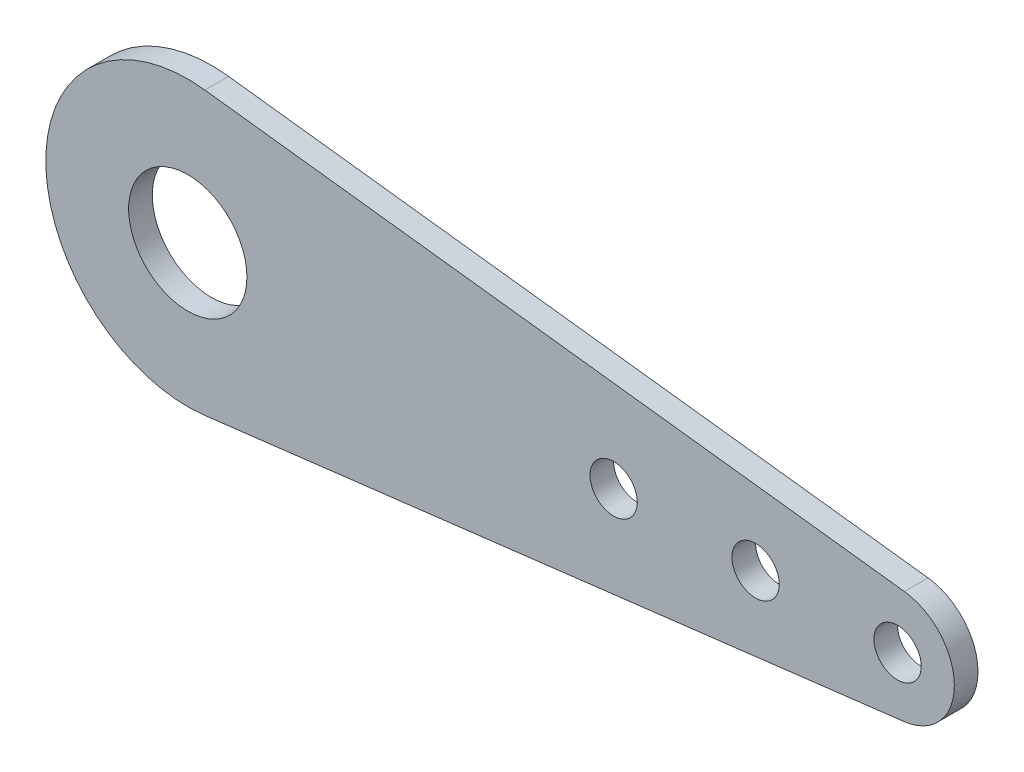
ISO-10303-21;
HEADER;
FILE_DESCRIPTION(('STEP AP214'),'2;1');
FILE_NAME('part.step','',(''),(''),'','','');
FILE_SCHEMA(('AUTOMOTIVE_DESIGN { 1 0 10303 214 1 1 1 1 }'));
ENDSEC;
DATA;
#1=APPLICATION_CONTEXT('core data for automotive mechanical design processes');
#2=APPLICATION_PROTOCOL_DEFINITION('international standard','automotive_design',2000,#1);
#3=PRODUCT_CONTEXT('',#1,'mechanical');
#4=PRODUCT('Part','Part','',(#3));
#5=PRODUCT_RELATED_PRODUCT_CATEGORY('part','',(#4));
#6=PRODUCT_DEFINITION_FORMATION('','',#4);
#7=PRODUCT_DEFINITION_CONTEXT('part definition',#1,'design');
#8=PRODUCT_DEFINITION('design','',#6,#7);
#9=PRODUCT_DEFINITION_SHAPE('','',#8);
#10=(LENGTH_UNIT() NAMED_UNIT(*) SI_UNIT(.MILLI.,.METRE.));
#11=(NAMED_UNIT(*) PLANE_ANGLE_UNIT() SI_UNIT($,.RADIAN.));
#12=(NAMED_UNIT(*) SI_UNIT($,.STERADIAN.) SOLID_ANGLE_UNIT());
#13=UNCERTAINTY_MEASURE_WITH_UNIT(LENGTH_MEASURE(1.E-05),#10,'distance_accuracy_value','');
#14=(GEOMETRIC_REPRESENTATION_CONTEXT(3) GLOBAL_UNCERTAINTY_ASSIGNED_CONTEXT((#13)) GLOBAL_UNIT_ASSIGNED_CONTEXT((#10,
#11,#12)) REPRESENTATION_CONTEXT('',''));
#15=CARTESIAN_POINT('',(0.,0.,0.));
#16=DIRECTION('',(0.,0.,1.));
#17=DIRECTION('',(1.,0.,0.));
#18=AXIS2_PLACEMENT_3D('',#15,#16,#17);
#19=CARTESIAN_POINT('',(0.,0.,1.5875));
#20=DIRECTION('',(0.,0.,-1.));
#21=DIRECTION('',(1.,0.,0.));
#22=AXIS2_PLACEMENT_3D('',#19,#20,#21);
#23=CYLINDRICAL_SURFACE('',#22,19.05);
#24=DIRECTION('',(0.,0.,-1.));
#25=VECTOR('',#24,1.);
#26=CARTESIAN_POINT('',(2.286,-18.9123426364901,1.5875));
#27=LINE('',#26,#25);
#28=CARTESIAN_POINT('',(2.286,-18.9123426364901,1.5875));
#29=VERTEX_POINT('',#28);
#30=CARTESIAN_POINT('',(2.286,-18.9123426364901,-1.5875));
#31=VERTEX_POINT('',#30);
#32=EDGE_CURVE('E49',#29,#31,#27,.T.);
#33=ORIENTED_EDGE('',*,*,#32,.F.);
#34=CARTESIAN_POINT('',(0.,0.,1.5875));
#35=DIRECTION('',(0.,0.,1.));
#36=DIRECTION('',(1.,0.,0.));
#37=AXIS2_PLACEMENT_3D('',#34,#35,#36);
#38=CIRCLE('',#37,19.05);
#39=CARTESIAN_POINT('',(2.286,18.9123426364901,1.5875));
#40=VERTEX_POINT('',#39);
#41=EDGE_CURVE('E121',#40,#29,#38,.T.);
#42=ORIENTED_EDGE('',*,*,#41,.F.);
#43=DIRECTION('',(0.,0.,-1.));
#44=VECTOR('',#43,1.);
#45=CARTESIAN_POINT('',(2.286,18.9123426364901,1.5875));
#46=LINE('',#45,#44);
#47=CARTESIAN_POINT('',(2.286,18.9123426364901,-1.5875));
#48=VERTEX_POINT('',#47);
#49=EDGE_CURVE('E11',#40,#48,#46,.T.);
#50=ORIENTED_EDGE('',*,*,#49,.T.);
#51=CARTESIAN_POINT('',(0.,0.,-1.5875));
#52=DIRECTION('',(0.,0.,1.));
#53=DIRECTION('',(1.,0.,0.));
#54=AXIS2_PLACEMENT_3D('',#51,#52,#53);
#55=CIRCLE('',#54,19.05);
#56=EDGE_CURVE('E92',#48,#31,#55,.T.);
#57=ORIENTED_EDGE('',*,*,#56,.T.);
#58=EDGE_LOOP('',(#33,#42,#50,#57));
#59=FACE_BOUND('',#58,.T.);
#60=ADVANCED_FACE('F45',(#59),#23,.T.);
#61=CARTESIAN_POINT('',(2.28600000000001,18.9123426364901,1.5875));
#62=DIRECTION('',(-0.12,-0.992773891679268,0.));
#63=DIRECTION('',(0.992773891679269,-0.12,0.));
#64=AXIS2_PLACEMENT_3D('',#61,#62,#63);
#65=PLANE('',#64);
#66=ORIENTED_EDGE('',*,*,#49,.F.);
#67=DIRECTION('',(0.992773891679269,-0.12,0.));
#68=VECTOR('',#67,1.);
#69=CARTESIAN_POINT('',(2.28600000000001,18.9123426364901,1.5875));
#70=LINE('',#69,#68);
#71=CARTESIAN_POINT('',(96.1644,7.56493705459603,1.5875));
#72=VERTEX_POINT('',#71);
#73=EDGE_CURVE('E62',#40,#72,#70,.T.);
#74=ORIENTED_EDGE('',*,*,#73,.T.);
#75=DIRECTION('',(0.,0.,-1.));
#76=VECTOR('',#75,1.);
#77=CARTESIAN_POINT('',(96.1644,7.56493705459603,1.5875));
#78=LINE('',#77,#76);
#79=CARTESIAN_POINT('',(96.1644,7.56493705459603,-1.5875));
#80=VERTEX_POINT('',#79);
#81=EDGE_CURVE('E54',#72,#80,#78,.T.);
#82=ORIENTED_EDGE('',*,*,#81,.T.);
#83=DIRECTION('',(0.992773891679269,-0.12,0.));
#84=VECTOR('',#83,1.);
#85=CARTESIAN_POINT('',(2.28600000000001,18.9123426364901,-1.5875));
#86=LINE('',#85,#84);
#87=EDGE_CURVE('E114',#48,#80,#86,.T.);
#88=ORIENTED_EDGE('',*,*,#87,.F.);
#89=EDGE_LOOP('',(#66,#74,#82,#88));
#90=FACE_BOUND('',#89,.T.);
#91=ADVANCED_FACE('F113',(#90),#65,.F.);
#92=CARTESIAN_POINT('',(95.25,0.,1.5875));
#93=DIRECTION('',(0.,0.,-1.));
#94=DIRECTION('',(1.,0.,0.));
#95=AXIS2_PLACEMENT_3D('',#92,#93,#94);
#96=CYLINDRICAL_SURFACE('',#95,7.62);
#97=ORIENTED_EDGE('',*,*,#81,.F.);
#98=CARTESIAN_POINT('',(95.25,0.,1.5875));
#99=DIRECTION('',(0.,0.,1.));
#100=DIRECTION('',(1.,0.,0.));
#101=AXIS2_PLACEMENT_3D('',#98,#99,#100);
#102=CIRCLE('',#101,7.62);
#103=CARTESIAN_POINT('',(96.1644,-7.56493705459603,1.5875));
#104=VERTEX_POINT('',#103);
#105=EDGE_CURVE('E67',#104,#72,#102,.T.);
#106=ORIENTED_EDGE('',*,*,#105,.F.);
#107=DIRECTION('',(0.,0.,-1.));
#108=VECTOR('',#107,1.);
#109=CARTESIAN_POINT('',(96.1644,-7.56493705459603,1.5875));
#110=LINE('',#109,#108);
#111=CARTESIAN_POINT('',(96.1644,-7.56493705459603,-1.5875));
#112=VERTEX_POINT('',#111);
#113=EDGE_CURVE('E106',#104,#112,#110,.T.);
#114=ORIENTED_EDGE('',*,*,#113,.T.);
#115=CARTESIAN_POINT('',(95.25,0.,-1.5875));
#116=DIRECTION('',(0.,0.,1.));
#117=DIRECTION('',(1.,0.,0.));
#118=AXIS2_PLACEMENT_3D('',#115,#116,#117);
#119=CIRCLE('',#118,7.62);
#120=EDGE_CURVE('E93',#112,#80,#119,.T.);
#121=ORIENTED_EDGE('',*,*,#120,.T.);
#122=EDGE_LOOP('',(#97,#106,#114,#121));
#123=FACE_BOUND('',#122,.T.);
#124=ADVANCED_FACE('F116',(#123),#96,.T.);
#125=CARTESIAN_POINT('',(0.,0.,1.5875));
#126=DIRECTION('',(0.,0.,-1.));
#127=DIRECTION('',(1.,0.,0.));
#128=AXIS2_PLACEMENT_3D('',#125,#126,#127);
#129=CYLINDRICAL_SURFACE('',#128,7.9375);
#130=CARTESIAN_POINT('',(0.,0.,1.5875));
#131=DIRECTION('',(0.,0.,1.));
#132=DIRECTION('',(1.,0.,0.));
#133=AXIS2_PLACEMENT_3D('',#130,#131,#132);
#134=CIRCLE('',#133,7.9375);
#135=CARTESIAN_POINT('',(7.9375,0.,1.5875));
#136=VERTEX_POINT('',#135);
#137=EDGE_CURVE('E118',#136,#136,#134,.T.);
#138=ORIENTED_EDGE('',*,*,#137,.T.);
#139=EDGE_LOOP('',(#138));
#140=FACE_BOUND('',#139,.T.);
#141=CARTESIAN_POINT('',(0.,0.,-1.5875));
#142=DIRECTION('',(0.,0.,1.));
#143=DIRECTION('',(1.,0.,0.));
#144=AXIS2_PLACEMENT_3D('',#141,#142,#143);
#145=CIRCLE('',#144,7.9375);
#146=CARTESIAN_POINT('',(7.9375,0.,-1.5875));
#147=VERTEX_POINT('',#146);
#148=EDGE_CURVE('E102',#147,#147,#145,.T.);
#149=ORIENTED_EDGE('',*,*,#148,.F.);
#150=EDGE_LOOP('',(#149));
#151=FACE_BOUND('',#150,.T.);
#152=ADVANCED_FACE('F47',(#140,#151),#129,.F.);
#153=CARTESIAN_POINT('',(2.28600000000001,-18.9123426364901,1.5875));
#154=DIRECTION('',(0.12,-0.992773891679268,0.));
#155=DIRECTION('',(0.992773891679269,0.12,0.));
#156=AXIS2_PLACEMENT_3D('',#153,#154,#155);
#157=PLANE('',#156);
#158=ORIENTED_EDGE('',*,*,#113,.F.);
#159=DIRECTION('',(0.992773891679269,0.12,0.));
#160=VECTOR('',#159,1.);
#161=CARTESIAN_POINT('',(2.28600000000001,-18.9123426364901,1.5875));
#162=LINE('',#161,#160);
#163=EDGE_CURVE('E105',#29,#104,#162,.T.);
#164=ORIENTED_EDGE('',*,*,#163,.F.);
#165=ORIENTED_EDGE('',*,*,#32,.T.);
#166=DIRECTION('',(0.992773891679269,0.12,0.));
#167=VECTOR('',#166,1.);
#168=CARTESIAN_POINT('',(2.28600000000001,-18.9123426364901,-1.5875));
#169=LINE('',#168,#167);
#170=EDGE_CURVE('E88',#31,#112,#169,.T.);
#171=ORIENTED_EDGE('',*,*,#170,.T.);
#172=EDGE_LOOP('',(#158,#164,#165,#171));
#173=FACE_BOUND('',#172,.T.);
#174=ADVANCED_FACE('F104',(#173),#157,.T.);
#175=CARTESIAN_POINT('',(0.,0.,1.5875));
#176=DIRECTION('',(0.,0.,-1.));
#177=DIRECTION('',(1.,0.,0.));
#178=AXIS2_PLACEMENT_3D('',#175,#176,#177);
#179=PLANE('',#178);
#180=CARTESIAN_POINT('',(57.15,0.,1.5875));
#181=DIRECTION('',(0.,0.,1.));
#182=DIRECTION('',(1.,0.,0.));
#183=AXIS2_PLACEMENT_3D('',#180,#181,#182);
#184=CIRCLE('',#183,3.175);
#185=CARTESIAN_POINT('',(60.325,0.,1.5875));
#186=VERTEX_POINT('',#185);
#187=EDGE_CURVE('E159',#186,#186,#184,.T.);
#188=ORIENTED_EDGE('',*,*,#187,.F.);
#189=EDGE_LOOP('',(#188));
#190=FACE_BOUND('',#189,.T.);
#191=CARTESIAN_POINT('',(76.2,0.,1.5875));
#192=DIRECTION('',(0.,0.,1.));
#193=DIRECTION('',(1.,0.,0.));
#194=AXIS2_PLACEMENT_3D('',#191,#192,#193);
#195=CIRCLE('',#194,3.175);
#196=CARTESIAN_POINT('',(79.375,0.,1.5875));
#197=VERTEX_POINT('',#196);
#198=EDGE_CURVE('E165',#197,#197,#195,.T.);
#199=ORIENTED_EDGE('',*,*,#198,.F.);
#200=EDGE_LOOP('',(#199));
#201=FACE_BOUND('',#200,.T.);
#202=CARTESIAN_POINT('',(95.25,0.,1.5875));
#203=DIRECTION('',(0.,0.,1.));
#204=DIRECTION('',(1.,0.,0.));
#205=AXIS2_PLACEMENT_3D('',#202,#203,#204);
#206=CIRCLE('',#205,3.175);
#207=CARTESIAN_POINT('',(98.425,0.,1.5875));
#208=VERTEX_POINT('',#207);
#209=EDGE_CURVE('E166',#208,#208,#206,.T.);
#210=ORIENTED_EDGE('',*,*,#209,.F.);
#211=EDGE_LOOP('',(#210));
#212=FACE_BOUND('',#211,.T.);
#213=ORIENTED_EDGE('',*,*,#137,.F.);
#214=EDGE_LOOP('',(#213));
#215=FACE_BOUND('',#214,.T.);
#216=ORIENTED_EDGE('',*,*,#41,.T.);
#217=ORIENTED_EDGE('',*,*,#163,.T.);
#218=ORIENTED_EDGE('',*,*,#105,.T.);
#219=ORIENTED_EDGE('',*,*,#73,.F.);
#220=EDGE_LOOP('',(#216,#217,#218,#219));
#221=FACE_BOUND('',#220,.T.);
#222=ADVANCED_FACE('F124',(#190,#201,#212,#215,#221),#179,.F.);
#223=CARTESIAN_POINT('',(0.,0.,-1.5875));
#224=DIRECTION('',(0.,0.,-1.));
#225=DIRECTION('',(1.,0.,0.));
#226=AXIS2_PLACEMENT_3D('',#223,#224,#225);
#227=PLANE('',#226);
#228=CARTESIAN_POINT('',(57.15,0.,-1.5875));
#229=DIRECTION('',(0.,0.,1.));
#230=DIRECTION('',(1.,0.,0.));
#231=AXIS2_PLACEMENT_3D('',#228,#229,#230);
#232=CIRCLE('',#231,3.175);
#233=CARTESIAN_POINT('',(60.325,0.,-1.5875));
#234=VERTEX_POINT('',#233);
#235=EDGE_CURVE('E156',#234,#234,#232,.T.);
#236=ORIENTED_EDGE('',*,*,#235,.T.);
#237=EDGE_LOOP('',(#236));
#238=FACE_BOUND('',#237,.T.);
#239=CARTESIAN_POINT('',(76.2,0.,-1.5875));
#240=DIRECTION('',(0.,0.,1.));
#241=DIRECTION('',(1.,0.,0.));
#242=AXIS2_PLACEMENT_3D('',#239,#240,#241);
#243=CIRCLE('',#242,3.175);
#244=CARTESIAN_POINT('',(79.375,0.,-1.5875));
#245=VERTEX_POINT('',#244);
#246=EDGE_CURVE('E169',#245,#245,#243,.T.);
#247=ORIENTED_EDGE('',*,*,#246,.T.);
#248=EDGE_LOOP('',(#247));
#249=FACE_BOUND('',#248,.T.);
#250=CARTESIAN_POINT('',(95.25,0.,-1.5875));
#251=DIRECTION('',(0.,0.,1.));
#252=DIRECTION('',(1.,0.,0.));
#253=AXIS2_PLACEMENT_3D('',#250,#251,#252);
#254=CIRCLE('',#253,3.175);
#255=CARTESIAN_POINT('',(98.425,0.,-1.5875));
#256=VERTEX_POINT('',#255);
#257=EDGE_CURVE('E162',#256,#256,#254,.T.);
#258=ORIENTED_EDGE('',*,*,#257,.T.);
#259=EDGE_LOOP('',(#258));
#260=FACE_BOUND('',#259,.T.);
#261=ORIENTED_EDGE('',*,*,#148,.T.);
#262=EDGE_LOOP('',(#261));
#263=FACE_BOUND('',#262,.T.);
#264=ORIENTED_EDGE('',*,*,#56,.F.);
#265=ORIENTED_EDGE('',*,*,#87,.T.);
#266=ORIENTED_EDGE('',*,*,#120,.F.);
#267=ORIENTED_EDGE('',*,*,#170,.F.);
#268=EDGE_LOOP('',(#264,#265,#266,#267));
#269=FACE_BOUND('',#268,.T.);
#270=ADVANCED_FACE('F90',(#238,#249,#260,#263,#269),#227,.T.);
#271=CARTESIAN_POINT('',(95.25,0.,-1.5875));
#272=DIRECTION('',(0.,0.,1.));
#273=DIRECTION('',(-1.,0.,0.));
#274=AXIS2_PLACEMENT_3D('',#271,#272,#273);
#275=CYLINDRICAL_SURFACE('',#274,3.175);
#276=ORIENTED_EDGE('',*,*,#257,.F.);
#277=EDGE_LOOP('',(#276));
#278=FACE_BOUND('',#277,.T.);
#279=ORIENTED_EDGE('',*,*,#209,.T.);
#280=EDGE_LOOP('',(#279));
#281=FACE_BOUND('',#280,.T.);
#282=ADVANCED_FACE('F132',(#278,#281),#275,.F.);
#283=CARTESIAN_POINT('',(76.2,0.,-1.5875));
#284=DIRECTION('',(0.,0.,1.));
#285=DIRECTION('',(-1.,0.,0.));
#286=AXIS2_PLACEMENT_3D('',#283,#284,#285);
#287=CYLINDRICAL_SURFACE('',#286,3.175);
#288=ORIENTED_EDGE('',*,*,#246,.F.);
#289=EDGE_LOOP('',(#288));
#290=FACE_BOUND('',#289,.T.);
#291=ORIENTED_EDGE('',*,*,#198,.T.);
#292=EDGE_LOOP('',(#291));
#293=FACE_BOUND('',#292,.T.);
#294=ADVANCED_FACE('F178',(#290,#293),#287,.F.);
#295=CARTESIAN_POINT('',(57.15,0.,-1.5875));
#296=DIRECTION('',(0.,0.,1.));
#297=DIRECTION('',(-1.,0.,0.));
#298=AXIS2_PLACEMENT_3D('',#295,#296,#297);
#299=CYLINDRICAL_SURFACE('',#298,3.175);
#300=ORIENTED_EDGE('',*,*,#235,.F.);
#301=EDGE_LOOP('',(#300));
#302=FACE_BOUND('',#301,.T.);
#303=ORIENTED_EDGE('',*,*,#187,.T.);
#304=EDGE_LOOP('',(#303));
#305=FACE_BOUND('',#304,.T.);
#306=ADVANCED_FACE('F176',(#302,#305),#299,.F.);
#307=CLOSED_SHELL('',(#60,#91,#124,#152,#174,#222,#270,#282,#294,#306));
#308=MANIFOLD_SOLID_BREP('B2',#307);
#309=ADVANCED_BREP_SHAPE_REPRESENTATION('',(#18,#308),#14);
#310=SHAPE_DEFINITION_REPRESENTATION(#9,#309);
ENDSEC;
END-ISO-10303-21;
